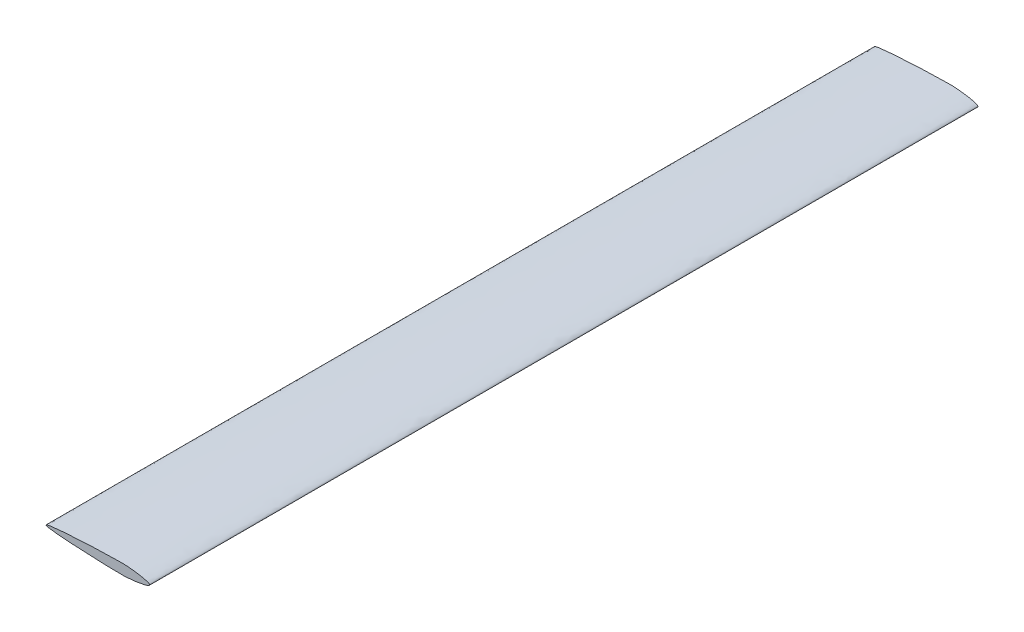
ISO-10303-21;
HEADER;
FILE_DESCRIPTION(('STEP AP214'),'2;1');
FILE_NAME('part.step','',(''),(''),'','','');
FILE_SCHEMA(('AUTOMOTIVE_DESIGN { 1 0 10303 214 1 1 1 1 }'));
ENDSEC;
DATA;
#1=APPLICATION_CONTEXT('core data for automotive mechanical design processes');
#2=APPLICATION_PROTOCOL_DEFINITION('international standard','automotive_design',2000,#1);
#3=PRODUCT_CONTEXT('',#1,'mechanical');
#4=PRODUCT('Part','Part','',(#3));
#5=PRODUCT_RELATED_PRODUCT_CATEGORY('part','',(#4));
#6=PRODUCT_DEFINITION_FORMATION('','',#4);
#7=PRODUCT_DEFINITION_CONTEXT('part definition',#1,'design');
#8=PRODUCT_DEFINITION('design','',#6,#7);
#9=PRODUCT_DEFINITION_SHAPE('','',#8);
#10=(LENGTH_UNIT() NAMED_UNIT(*) SI_UNIT(.MILLI.,.METRE.));
#11=(NAMED_UNIT(*) PLANE_ANGLE_UNIT() SI_UNIT($,.RADIAN.));
#12=(NAMED_UNIT(*) SI_UNIT($,.STERADIAN.) SOLID_ANGLE_UNIT());
#13=UNCERTAINTY_MEASURE_WITH_UNIT(LENGTH_MEASURE(1.E-05),#10,'distance_accuracy_value','');
#14=(GEOMETRIC_REPRESENTATION_CONTEXT(3) GLOBAL_UNCERTAINTY_ASSIGNED_CONTEXT((#13)) GLOBAL_UNIT_ASSIGNED_CONTEXT((#10,
#11,#12)) REPRESENTATION_CONTEXT('',''));
#15=CARTESIAN_POINT('',(0.,0.,0.));
#16=DIRECTION('',(0.,0.,1.));
#17=DIRECTION('',(1.,0.,0.));
#18=AXIS2_PLACEMENT_3D('',#15,#16,#17);
#19=CARTESIAN_POINT('',(0.,0.,6096.));
#20=CARTESIAN_POINT('',(1.11022302462516E-13,18.3166529505861,6096.));
#21=CARTESIAN_POINT('',(-141.449231205545,38.8841777766872,6096.));
#22=CARTESIAN_POINT('',(-384.483659546408,36.5657609354556,6096.));
#23=CARTESIAN_POINT('',(-1123.17441454356,-1.75485560918322E-13,6096.));
#24=CARTESIAN_POINT('',(-384.483659546406,-36.5657609354556,6096.));
#25=CARTESIAN_POINT('',(-141.449231205545,-38.8841777766873,6096.));
#26=CARTESIAN_POINT('',(-1.38777878078145E-13,-18.3166529505861,6096.));
#27=CARTESIAN_POINT('',(0.,0.,6096.));
#28=B_SPLINE_CURVE_WITH_KNOTS('',3,(#19,#20,#21,#22,#23,#24,#25,#26,#27),.UNSPECIFIED.,.T.,.F.,
(4,1,1,1,1,1,4),(0.,0.130248508630681,0.14625430978308,0.5,0.85374569021692,0.869751491369319,
1.),.UNSPECIFIED.);
#29=DIRECTION('',(0.,0.,-1.));
#30=VECTOR('',#29,1.);
#31=SURFACE_OF_LINEAR_EXTRUSION('',#28,#30);
#32=CARTESIAN_POINT('',(0.,0.,6096.));
#33=VERTEX_POINT('',#32);
#34=EDGE_CURVE('E10',#33,#33,#28,.T.);
#35=ORIENTED_EDGE('',*,*,#34,.F.);
#36=EDGE_LOOP('',(#35));
#37=FACE_BOUND('',#36,.T.);
#38=CARTESIAN_POINT('',(0.,0.,0.));
#39=CARTESIAN_POINT('',(1.11022302462516E-13,18.3166529505861,0.));
#40=CARTESIAN_POINT('',(-141.449231205545,38.8841777766872,0.));
#41=CARTESIAN_POINT('',(-384.483659546408,36.5657609354556,0.));
#42=CARTESIAN_POINT('',(-1123.17441454356,-1.75485560918322E-13,0.));
#43=CARTESIAN_POINT('',(-384.483659546406,-36.5657609354556,0.));
#44=CARTESIAN_POINT('',(-141.449231205545,-38.8841777766873,0.));
#45=CARTESIAN_POINT('',(-1.38777878078145E-13,-18.3166529505861,0.));
#46=CARTESIAN_POINT('',(0.,0.,0.));
#47=B_SPLINE_CURVE_WITH_KNOTS('',3,(#38,#39,#40,#41,#42,#43,#44,#45,#46),.UNSPECIFIED.,.T.,.F.,
(4,1,1,1,1,1,4),(0.,0.130248508630681,0.14625430978308,0.5,0.85374569021692,0.869751491369319,
1.),.UNSPECIFIED.);
#48=CARTESIAN_POINT('',(0.,0.,0.));
#49=VERTEX_POINT('',#48);
#50=EDGE_CURVE('E35',#49,#49,#47,.T.);
#51=ORIENTED_EDGE('',*,*,#50,.T.);
#52=EDGE_LOOP('',(#51));
#53=FACE_BOUND('',#52,.T.);
#54=ADVANCED_FACE('F31',(#37,#53),#31,.F.);
#55=CARTESIAN_POINT('',(-762.,0.,6096.));
#56=DIRECTION('',(0.,0.,-1.));
#57=DIRECTION('',(-1.,0.,0.));
#58=AXIS2_PLACEMENT_3D('',#55,#56,#57);
#59=PLANE('',#58);
#60=ORIENTED_EDGE('',*,*,#34,.T.);
#61=EDGE_LOOP('',(#60));
#62=FACE_BOUND('',#61,.T.);
#63=ADVANCED_FACE('F54',(#62),#59,.F.);
#64=CARTESIAN_POINT('',(-762.,0.,0.));
#65=DIRECTION('',(0.,0.,-1.));
#66=DIRECTION('',(-1.,0.,0.));
#67=AXIS2_PLACEMENT_3D('',#64,#65,#66);
#68=PLANE('',#67);
#69=ORIENTED_EDGE('',*,*,#50,.F.);
#70=EDGE_LOOP('',(#69));
#71=FACE_BOUND('',#70,.T.);
#72=ADVANCED_FACE('F52',(#71),#68,.T.);
#73=CLOSED_SHELL('',(#54,#63,#72));
#74=MANIFOLD_SOLID_BREP('B2',#73);
#75=ADVANCED_BREP_SHAPE_REPRESENTATION('',(#18,#74),#14);
#76=SHAPE_DEFINITION_REPRESENTATION(#9,#75);
ENDSEC;
END-ISO-10303-21;
